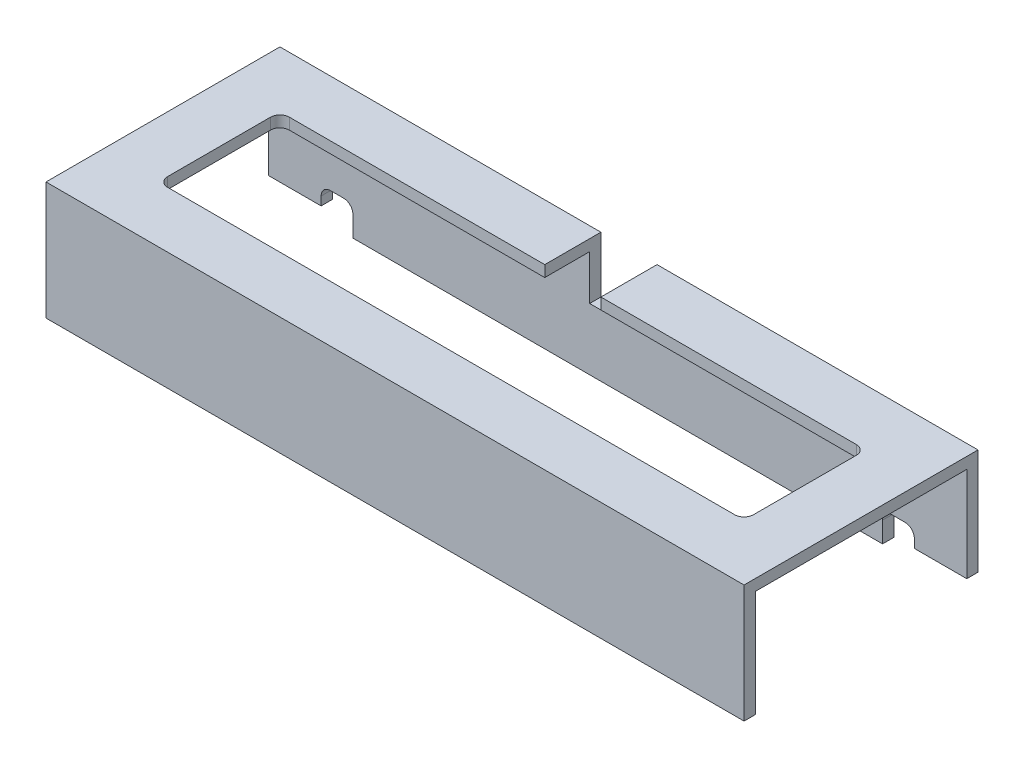
ISO-10303-21;
HEADER;
FILE_DESCRIPTION(('STEP AP214'),'2;1');
FILE_NAME('part.step','',(''),(''),'','','');
FILE_SCHEMA(('AUTOMOTIVE_DESIGN { 1 0 10303 214 1 1 1 1 }'));
ENDSEC;
DATA;
#1=APPLICATION_CONTEXT('core data for automotive mechanical design processes');
#2=APPLICATION_PROTOCOL_DEFINITION('international standard','automotive_design',2000,#1);
#3=PRODUCT_CONTEXT('',#1,'mechanical');
#4=PRODUCT('Part','Part','',(#3));
#5=PRODUCT_RELATED_PRODUCT_CATEGORY('part','',(#4));
#6=PRODUCT_DEFINITION_FORMATION('','',#4);
#7=PRODUCT_DEFINITION_CONTEXT('part definition',#1,'design');
#8=PRODUCT_DEFINITION('design','',#6,#7);
#9=PRODUCT_DEFINITION_SHAPE('','',#8);
#10=(LENGTH_UNIT() NAMED_UNIT(*) SI_UNIT(.MILLI.,.METRE.));
#11=(NAMED_UNIT(*) PLANE_ANGLE_UNIT() SI_UNIT($,.RADIAN.));
#12=(NAMED_UNIT(*) SI_UNIT($,.STERADIAN.) SOLID_ANGLE_UNIT());
#13=UNCERTAINTY_MEASURE_WITH_UNIT(LENGTH_MEASURE(1.E-05),#10,'distance_accuracy_value','');
#14=(GEOMETRIC_REPRESENTATION_CONTEXT(3) GLOBAL_UNCERTAINTY_ASSIGNED_CONTEXT((#13)) GLOBAL_UNIT_ASSIGNED_CONTEXT((#10,
#11,#12)) REPRESENTATION_CONTEXT('',''));
#15=CARTESIAN_POINT('',(0.,0.,0.));
#16=DIRECTION('',(0.,0.,1.));
#17=DIRECTION('',(1.,0.,0.));
#18=AXIS2_PLACEMENT_3D('',#15,#16,#17);
#19=CARTESIAN_POINT('',(451.478569788377,63.,-125.));
#20=DIRECTION('',(0.,-1.,0.));
#21=DIRECTION('',(0.,0.,-1.));
#22=AXIS2_PLACEMENT_3D('',#19,#20,#21);
#23=PLANE('',#22);
#24=DIRECTION('',(1.,0.,0.));
#25=VECTOR('',#24,1.);
#26=CARTESIAN_POINT('',(0.,63.,-95.));
#27=LINE('',#26,#25);
#28=CARTESIAN_POINT('',(139.999999999998,63.,-95.));
#29=VERTEX_POINT('',#28);
#30=CARTESIAN_POINT('',(276.499999999998,63.,-95.));
#31=VERTEX_POINT('',#30);
#32=EDGE_CURVE('E268',#29,#31,#27,.T.);
#33=ORIENTED_EDGE('',*,*,#32,.T.);
#34=CARTESIAN_POINT('',(276.499999999998,63.,-90.));
#35=DIRECTION('',(0.,-1.,0.));
#36=DIRECTION('',(0.,0.,-1.));
#37=AXIS2_PLACEMENT_3D('',#34,#35,#36);
#38=CIRCLE('',#37,5.);
#39=CARTESIAN_POINT('',(281.499999999998,63.,-90.));
#40=VERTEX_POINT('',#39);
#41=EDGE_CURVE('E362',#31,#40,#38,.T.);
#42=ORIENTED_EDGE('',*,*,#41,.T.);
#43=DIRECTION('',(0.,0.,-1.));
#44=VECTOR('',#43,1.);
#45=CARTESIAN_POINT('',(281.499999999998,63.,0.));
#46=LINE('',#45,#44);
#47=CARTESIAN_POINT('',(281.499999999998,63.,-35.));
#48=VERTEX_POINT('',#47);
#49=EDGE_CURVE('E395',#48,#40,#46,.T.);
#50=ORIENTED_EDGE('',*,*,#49,.F.);
#51=CARTESIAN_POINT('',(276.499999999998,63.,-35.));
#52=DIRECTION('',(0.,-1.,0.));
#53=DIRECTION('',(0.,0.,-1.));
#54=AXIS2_PLACEMENT_3D('',#51,#52,#53);
#55=CIRCLE('',#54,5.);
#56=CARTESIAN_POINT('',(276.499999999998,63.,-30.));
#57=VERTEX_POINT('',#56);
#58=EDGE_CURVE('E358',#48,#57,#55,.T.);
#59=ORIENTED_EDGE('',*,*,#58,.T.);
#60=DIRECTION('',(1.,0.,0.));
#61=VECTOR('',#60,1.);
#62=CARTESIAN_POINT('',(0.,63.,-30.));
#63=LINE('',#62,#61);
#64=CARTESIAN_POINT('',(-26.5000000000014,63.,-30.));
#65=VERTEX_POINT('',#64);
#66=EDGE_CURVE('E389',#65,#57,#63,.T.);
#67=ORIENTED_EDGE('',*,*,#66,.F.);
#68=CARTESIAN_POINT('',(-26.5000000000014,63.,-35.));
#69=DIRECTION('',(0.,-1.,0.));
#70=DIRECTION('',(0.,0.,-1.));
#71=AXIS2_PLACEMENT_3D('',#68,#69,#70);
#72=CIRCLE('',#71,5.);
#73=CARTESIAN_POINT('',(-31.5000000000014,63.,-35.));
#74=VERTEX_POINT('',#73);
#75=EDGE_CURVE('E365',#65,#74,#72,.T.);
#76=ORIENTED_EDGE('',*,*,#75,.T.);
#77=DIRECTION('',(0.,0.,1.));
#78=VECTOR('',#77,1.);
#79=CARTESIAN_POINT('',(-31.5000000000014,63.,0.));
#80=LINE('',#79,#78);
#81=CARTESIAN_POINT('',(-31.5000000000014,63.,-90.));
#82=VERTEX_POINT('',#81);
#83=EDGE_CURVE('E388',#82,#74,#80,.T.);
#84=ORIENTED_EDGE('',*,*,#83,.F.);
#85=CARTESIAN_POINT('',(-26.5000000000014,63.,-90.));
#86=DIRECTION('',(0.,-1.,0.));
#87=DIRECTION('',(0.,0.,-1.));
#88=AXIS2_PLACEMENT_3D('',#85,#86,#87);
#89=CIRCLE('',#88,5.);
#90=CARTESIAN_POINT('',(-26.5000000000014,63.,-95.));
#91=VERTEX_POINT('',#90);
#92=EDGE_CURVE('E44',#82,#91,#89,.T.);
#93=ORIENTED_EDGE('',*,*,#92,.T.);
#94=CARTESIAN_POINT('',(109.999999999998,63.,-95.));
#95=VERTEX_POINT('',#94);
#96=EDGE_CURVE('E393',#91,#95,#27,.T.);
#97=ORIENTED_EDGE('',*,*,#96,.T.);
#98=DIRECTION('',(0.,0.,-1.));
#99=VECTOR('',#98,1.);
#100=CARTESIAN_POINT('',(109.999999999998,63.,-95.));
#101=LINE('',#100,#99);
#102=CARTESIAN_POINT('',(109.999999999998,63.,-125.));
#103=VERTEX_POINT('',#102);
#104=EDGE_CURVE('E277',#95,#103,#101,.T.);
#105=ORIENTED_EDGE('',*,*,#104,.T.);
#106=DIRECTION('',(-1.,0.,0.));
#107=VECTOR('',#106,1.);
#108=CARTESIAN_POINT('',(451.478569788377,63.,-125.));
#109=LINE('',#108,#107);
#110=CARTESIAN_POINT('',(-61.5000000000014,63.,-125.));
#111=VERTEX_POINT('',#110);
#112=EDGE_CURVE('E503',#103,#111,#109,.T.);
#113=ORIENTED_EDGE('',*,*,#112,.T.);
#114=DIRECTION('',(0.,0.,-1.));
#115=VECTOR('',#114,1.);
#116=CARTESIAN_POINT('',(-61.5000000000014,63.,-125.));
#117=LINE('',#116,#115);
#118=CARTESIAN_POINT('',(-61.5000000000014,63.,0.));
#119=VERTEX_POINT('',#118);
#120=EDGE_CURVE('E473',#119,#111,#117,.T.);
#121=ORIENTED_EDGE('',*,*,#120,.F.);
#122=DIRECTION('',(-1.,0.,0.));
#123=VECTOR('',#122,1.);
#124=CARTESIAN_POINT('',(451.478569788377,63.,0.));
#125=LINE('',#124,#123);
#126=CARTESIAN_POINT('',(311.499999999998,63.,0.));
#127=VERTEX_POINT('',#126);
#128=EDGE_CURVE('E482',#127,#119,#125,.T.);
#129=ORIENTED_EDGE('',*,*,#128,.F.);
#130=DIRECTION('',(0.,0.,-1.));
#131=VECTOR('',#130,1.);
#132=CARTESIAN_POINT('',(311.499999999998,63.,-125.));
#133=LINE('',#132,#131);
#134=CARTESIAN_POINT('',(311.499999999998,63.,-125.));
#135=VERTEX_POINT('',#134);
#136=EDGE_CURVE('E487',#127,#135,#133,.T.);
#137=ORIENTED_EDGE('',*,*,#136,.T.);
#138=CARTESIAN_POINT('',(139.999999999998,63.,-125.));
#139=VERTEX_POINT('',#138);
#140=EDGE_CURVE('E504',#135,#139,#109,.T.);
#141=ORIENTED_EDGE('',*,*,#140,.T.);
#142=DIRECTION('',(0.,0.,-1.));
#143=VECTOR('',#142,1.);
#144=CARTESIAN_POINT('',(139.999999999998,63.,-95.));
#145=LINE('',#144,#143);
#146=EDGE_CURVE('E419',#29,#139,#145,.T.);
#147=ORIENTED_EDGE('',*,*,#146,.F.);
#148=EDGE_LOOP('',(#33,#42,#50,#59,#67,#76,#84,#93,#97,#105,#113,#121,#129,#137,#141,#147));
#149=FACE_BOUND('',#148,.T.);
#150=ADVANCED_FACE('F36',(#149),#23,.F.);
#151=CARTESIAN_POINT('',(451.478569788377,57.,-6.));
#152=DIRECTION('',(0.,1.,0.));
#153=DIRECTION('',(0.,0.,1.));
#154=AXIS2_PLACEMENT_3D('',#151,#152,#153);
#155=PLANE('',#154);
#156=DIRECTION('',(-1.,0.,0.));
#157=VECTOR('',#156,1.);
#158=CARTESIAN_POINT('',(0.,57.,-95.));
#159=LINE('',#158,#157);
#160=CARTESIAN_POINT('',(109.999999999998,57.,-95.));
#161=VERTEX_POINT('',#160);
#162=CARTESIAN_POINT('',(-26.5000000000014,57.,-95.));
#163=VERTEX_POINT('',#162);
#164=EDGE_CURVE('E269',#161,#163,#159,.T.);
#165=ORIENTED_EDGE('',*,*,#164,.T.);
#166=CARTESIAN_POINT('',(-26.5000000000014,57.,-90.));
#167=DIRECTION('',(0.,1.,0.));
#168=DIRECTION('',(0.,0.,1.));
#169=AXIS2_PLACEMENT_3D('',#166,#167,#168);
#170=CIRCLE('',#169,5.);
#171=CARTESIAN_POINT('',(-31.5000000000014,57.,-90.));
#172=VERTEX_POINT('',#171);
#173=EDGE_CURVE('E11',#163,#172,#170,.T.);
#174=ORIENTED_EDGE('',*,*,#173,.T.);
#175=DIRECTION('',(0.,0.,-1.));
#176=VECTOR('',#175,1.);
#177=CARTESIAN_POINT('',(-31.5000000000014,57.,0.));
#178=LINE('',#177,#176);
#179=CARTESIAN_POINT('',(-31.5000000000014,57.,-35.));
#180=VERTEX_POINT('',#179);
#181=EDGE_CURVE('E375',#180,#172,#178,.T.);
#182=ORIENTED_EDGE('',*,*,#181,.F.);
#183=CARTESIAN_POINT('',(-26.5000000000014,57.,-35.));
#184=DIRECTION('',(0.,1.,0.));
#185=DIRECTION('',(0.,0.,1.));
#186=AXIS2_PLACEMENT_3D('',#183,#184,#185);
#187=CIRCLE('',#186,5.);
#188=CARTESIAN_POINT('',(-26.5000000000014,57.,-30.));
#189=VERTEX_POINT('',#188);
#190=EDGE_CURVE('E367',#180,#189,#187,.T.);
#191=ORIENTED_EDGE('',*,*,#190,.T.);
#192=DIRECTION('',(-1.,0.,0.));
#193=VECTOR('',#192,1.);
#194=CARTESIAN_POINT('',(0.,57.,-30.));
#195=LINE('',#194,#193);
#196=CARTESIAN_POINT('',(276.499999999998,57.,-30.));
#197=VERTEX_POINT('',#196);
#198=EDGE_CURVE('E372',#197,#189,#195,.T.);
#199=ORIENTED_EDGE('',*,*,#198,.F.);
#200=CARTESIAN_POINT('',(276.499999999998,57.,-35.));
#201=DIRECTION('',(0.,1.,0.));
#202=DIRECTION('',(0.,0.,1.));
#203=AXIS2_PLACEMENT_3D('',#200,#201,#202);
#204=CIRCLE('',#203,5.);
#205=CARTESIAN_POINT('',(281.499999999998,57.,-35.));
#206=VERTEX_POINT('',#205);
#207=EDGE_CURVE('E360',#197,#206,#204,.T.);
#208=ORIENTED_EDGE('',*,*,#207,.T.);
#209=DIRECTION('',(0.,0.,1.));
#210=VECTOR('',#209,1.);
#211=CARTESIAN_POINT('',(281.499999999998,57.,0.));
#212=LINE('',#211,#210);
#213=CARTESIAN_POINT('',(281.499999999998,57.,-90.));
#214=VERTEX_POINT('',#213);
#215=EDGE_CURVE('E384',#214,#206,#212,.T.);
#216=ORIENTED_EDGE('',*,*,#215,.F.);
#217=CARTESIAN_POINT('',(276.499999999998,57.,-90.));
#218=DIRECTION('',(0.,1.,0.));
#219=DIRECTION('',(0.,0.,1.));
#220=AXIS2_PLACEMENT_3D('',#217,#218,#219);
#221=CIRCLE('',#220,5.);
#222=CARTESIAN_POINT('',(276.499999999998,57.,-95.));
#223=VERTEX_POINT('',#222);
#224=EDGE_CURVE('E264',#214,#223,#221,.T.);
#225=ORIENTED_EDGE('',*,*,#224,.T.);
#226=CARTESIAN_POINT('',(139.999999999998,57.,-95.));
#227=VERTEX_POINT('',#226);
#228=EDGE_CURVE('E255',#223,#227,#159,.T.);
#229=ORIENTED_EDGE('',*,*,#228,.T.);
#230=DIRECTION('',(0.,0.,1.));
#231=VECTOR('',#230,1.);
#232=CARTESIAN_POINT('',(139.999999999998,57.,-6.));
#233=LINE('',#232,#231);
#234=CARTESIAN_POINT('',(139.999999999998,57.,-119.));
#235=VERTEX_POINT('',#234);
#236=EDGE_CURVE('E260',#235,#227,#233,.T.);
#237=ORIENTED_EDGE('',*,*,#236,.F.);
#238=DIRECTION('',(-1.,0.,0.));
#239=VECTOR('',#238,1.);
#240=CARTESIAN_POINT('',(451.478569788377,57.,-119.));
#241=LINE('',#240,#239);
#242=CARTESIAN_POINT('',(311.499999999998,57.,-119.));
#243=VERTEX_POINT('',#242);
#244=EDGE_CURVE('E514',#243,#235,#241,.T.);
#245=ORIENTED_EDGE('',*,*,#244,.F.);
#246=DIRECTION('',(0.,0.,1.));
#247=VECTOR('',#246,1.);
#248=CARTESIAN_POINT('',(311.499999999998,57.,-6.00000000000004));
#249=LINE('',#248,#247);
#250=CARTESIAN_POINT('',(311.499999999998,57.,-6.));
#251=VERTEX_POINT('',#250);
#252=EDGE_CURVE('E489',#243,#251,#249,.T.);
#253=ORIENTED_EDGE('',*,*,#252,.T.);
#254=DIRECTION('',(-1.,0.,0.));
#255=VECTOR('',#254,1.);
#256=CARTESIAN_POINT('',(451.478569788377,57.,-6.));
#257=LINE('',#256,#255);
#258=CARTESIAN_POINT('',(-61.5000000000014,57.,-6.));
#259=VERTEX_POINT('',#258);
#260=EDGE_CURVE('E516',#251,#259,#257,.T.);
#261=ORIENTED_EDGE('',*,*,#260,.T.);
#262=DIRECTION('',(0.,0.,1.));
#263=VECTOR('',#262,1.);
#264=CARTESIAN_POINT('',(-61.5000000000014,57.,-5.99999999999994));
#265=LINE('',#264,#263);
#266=CARTESIAN_POINT('',(-61.5000000000014,57.,-119.));
#267=VERTEX_POINT('',#266);
#268=EDGE_CURVE('E464',#267,#259,#265,.T.);
#269=ORIENTED_EDGE('',*,*,#268,.F.);
#270=CARTESIAN_POINT('',(109.999999999998,57.,-119.));
#271=VERTEX_POINT('',#270);
#272=EDGE_CURVE('E513',#271,#267,#241,.T.);
#273=ORIENTED_EDGE('',*,*,#272,.F.);
#274=DIRECTION('',(0.,0.,1.));
#275=VECTOR('',#274,1.);
#276=CARTESIAN_POINT('',(109.999999999998,57.,-6.));
#277=LINE('',#276,#275);
#278=EDGE_CURVE('E284',#271,#161,#277,.T.);
#279=ORIENTED_EDGE('',*,*,#278,.T.);
#280=EDGE_LOOP('',(#165,#174,#182,#191,#199,#208,#216,#225,#229,#237,#245,#253,#261,#269,#273,#279));
#281=FACE_BOUND('',#280,.T.);
#282=ADVANCED_FACE('F257',(#281),#155,.F.);
#283=CARTESIAN_POINT('',(451.478569788377,0.,-125.));
#284=DIRECTION('',(0.,0.,1.));
#285=DIRECTION('',(0.,-1.,0.));
#286=AXIS2_PLACEMENT_3D('',#283,#284,#285);
#287=PLANE('',#286);
#288=ORIENTED_EDGE('',*,*,#112,.F.);
#289=DIRECTION('',(0.,1.,0.));
#290=VECTOR('',#289,1.);
#291=CARTESIAN_POINT('',(109.999999999998,0.,-125.));
#292=LINE('',#291,#290);
#293=CARTESIAN_POINT('',(109.999999999998,33.,-125.));
#294=VERTEX_POINT('',#293);
#295=EDGE_CURVE('E406',#294,#103,#292,.T.);
#296=ORIENTED_EDGE('',*,*,#295,.F.);
#297=DIRECTION('',(1.,0.,0.));
#298=VECTOR('',#297,1.);
#299=CARTESIAN_POINT('',(0.,33.0000000000001,-125.));
#300=LINE('',#299,#298);
#301=CARTESIAN_POINT('',(139.999999999998,33.,-125.));
#302=VERTEX_POINT('',#301);
#303=EDGE_CURVE('E404',#294,#302,#300,.T.);
#304=ORIENTED_EDGE('',*,*,#303,.T.);
#305=DIRECTION('',(0.,1.,0.));
#306=VECTOR('',#305,1.);
#307=CARTESIAN_POINT('',(139.999999999998,0.,-125.));
#308=LINE('',#307,#306);
#309=EDGE_CURVE('E408',#302,#139,#308,.T.);
#310=ORIENTED_EDGE('',*,*,#309,.T.);
#311=ORIENTED_EDGE('',*,*,#140,.F.);
#312=DIRECTION('',(0.,-1.,0.));
#313=VECTOR('',#312,1.);
#314=CARTESIAN_POINT('',(311.499999999998,0.,-125.));
#315=LINE('',#314,#313);
#316=CARTESIAN_POINT('',(311.499999999998,6.3999999999958,-125.));
#317=VERTEX_POINT('',#316);
#318=EDGE_CURVE('E483',#135,#317,#315,.T.);
#319=ORIENTED_EDGE('',*,*,#318,.T.);
#320=DIRECTION('',(1.,0.,0.));
#321=VECTOR('',#320,1.);
#322=CARTESIAN_POINT('',(-4.55984456540696E-13,6.3999999999751,-125.));
#323=LINE('',#322,#321);
#324=CARTESIAN_POINT('',(283.499999999998,6.3999999999953,-125.));
#325=VERTEX_POINT('',#324);
#326=EDGE_CURVE('E446',#325,#317,#323,.T.);
#327=ORIENTED_EDGE('',*,*,#326,.F.);
#328=DIRECTION('',(0.,1.,0.));
#329=VECTOR('',#328,1.);
#330=CARTESIAN_POINT('',(283.499999999998,0.,-125.));
#331=LINE('',#330,#329);
#332=CARTESIAN_POINT('',(283.499999999998,11.0000000000001,-125.));
#333=VERTEX_POINT('',#332);
#334=EDGE_CURVE('E443',#325,#333,#331,.T.);
#335=ORIENTED_EDGE('',*,*,#334,.T.);
#336=CARTESIAN_POINT('',(278.499999999998,11.0000000000001,-125.));
#337=DIRECTION('',(0.,0.,1.));
#338=DIRECTION('',(0.,-1.,0.));
#339=AXIS2_PLACEMENT_3D('',#336,#337,#338);
#340=CIRCLE('',#339,5.);
#341=CARTESIAN_POINT('',(278.499999999998,16.0000000000001,-125.));
#342=VERTEX_POINT('',#341);
#343=EDGE_CURVE('E354',#333,#342,#340,.T.);
#344=ORIENTED_EDGE('',*,*,#343,.T.);
#345=DIRECTION('',(1.,0.,0.));
#346=VECTOR('',#345,1.);
#347=CARTESIAN_POINT('',(0.,16.0000000000002,-125.));
#348=LINE('',#347,#346);
#349=CARTESIAN_POINT('',(271.499999999998,16.0000000000001,-125.));
#350=VERTEX_POINT('',#349);
#351=EDGE_CURVE('E451',#350,#342,#348,.T.);
#352=ORIENTED_EDGE('',*,*,#351,.F.);
#353=CARTESIAN_POINT('',(271.499999999998,11.0000000000001,-125.));
#354=DIRECTION('',(0.,0.,1.));
#355=DIRECTION('',(0.,-1.,0.));
#356=AXIS2_PLACEMENT_3D('',#353,#354,#355);
#357=CIRCLE('',#356,5.);
#358=CARTESIAN_POINT('',(266.499999999998,11.0000000000001,-125.));
#359=VERTEX_POINT('',#358);
#360=EDGE_CURVE('E350',#350,#359,#357,.T.);
#361=ORIENTED_EDGE('',*,*,#360,.T.);
#362=DIRECTION('',(0.,1.,0.));
#363=VECTOR('',#362,1.);
#364=CARTESIAN_POINT('',(266.499999999998,0.,-125.));
#365=LINE('',#364,#363);
#366=CARTESIAN_POINT('',(266.499999999998,0.,-125.));
#367=VERTEX_POINT('',#366);
#368=EDGE_CURVE('E448',#367,#359,#365,.T.);
#369=ORIENTED_EDGE('',*,*,#368,.F.);
#370=DIRECTION('',(-1.,0.,0.));
#371=VECTOR('',#370,1.);
#372=CARTESIAN_POINT('',(451.478569788377,0.,-125.));
#373=LINE('',#372,#371);
#374=CARTESIAN_POINT('',(-16.5000000000013,0.,-125.));
#375=VERTEX_POINT('',#374);
#376=EDGE_CURVE('E507',#367,#375,#373,.T.);
#377=ORIENTED_EDGE('',*,*,#376,.T.);
#378=DIRECTION('',(0.,1.,0.));
#379=VECTOR('',#378,1.);
#380=CARTESIAN_POINT('',(-16.5000000000013,0.,-125.));
#381=LINE('',#380,#379);
#382=CARTESIAN_POINT('',(-16.5000000000013,11.0000000000001,-125.));
#383=VERTEX_POINT('',#382);
#384=EDGE_CURVE('E431',#375,#383,#381,.T.);
#385=ORIENTED_EDGE('',*,*,#384,.T.);
#386=CARTESIAN_POINT('',(-21.5000000000013,11.0000000000001,-125.));
#387=DIRECTION('',(0.,0.,1.));
#388=DIRECTION('',(0.,-1.,0.));
#389=AXIS2_PLACEMENT_3D('',#386,#387,#388);
#390=CIRCLE('',#389,5.);
#391=CARTESIAN_POINT('',(-21.5000000000013,16.0000000000001,-125.));
#392=VERTEX_POINT('',#391);
#393=EDGE_CURVE('E346',#383,#392,#390,.T.);
#394=ORIENTED_EDGE('',*,*,#393,.T.);
#395=DIRECTION('',(-1.,0.,0.));
#396=VECTOR('',#395,1.);
#397=CARTESIAN_POINT('',(0.,16.0000000000001,-125.));
#398=LINE('',#397,#396);
#399=CARTESIAN_POINT('',(-28.5000000000013,16.0000000000001,-125.));
#400=VERTEX_POINT('',#399);
#401=EDGE_CURVE('E428',#392,#400,#398,.T.);
#402=ORIENTED_EDGE('',*,*,#401,.T.);
#403=CARTESIAN_POINT('',(-28.5000000000013,11.0000000000001,-125.));
#404=DIRECTION('',(0.,0.,1.));
#405=DIRECTION('',(0.,-1.,0.));
#406=AXIS2_PLACEMENT_3D('',#403,#404,#405);
#407=CIRCLE('',#406,5.);
#408=CARTESIAN_POINT('',(-33.5000000000013,11.0000000000001,-125.));
#409=VERTEX_POINT('',#408);
#410=EDGE_CURVE('E342',#400,#409,#407,.T.);
#411=ORIENTED_EDGE('',*,*,#410,.T.);
#412=DIRECTION('',(0.,1.,0.));
#413=VECTOR('',#412,1.);
#414=CARTESIAN_POINT('',(-33.5000000000013,0.,-125.));
#415=LINE('',#414,#413);
#416=CARTESIAN_POINT('',(-33.5000000000013,6.3999999999953,-125.));
#417=VERTEX_POINT('',#416);
#418=EDGE_CURVE('E425',#417,#409,#415,.T.);
#419=ORIENTED_EDGE('',*,*,#418,.F.);
#420=DIRECTION('',(-1.,0.,0.));
#421=VECTOR('',#420,1.);
#422=CARTESIAN_POINT('',(4.18316175349381E-13,6.39999999999311,-125.));
#423=LINE('',#422,#421);
#424=CARTESIAN_POINT('',(-61.5000000000014,6.39999999999621,-125.));
#425=VERTEX_POINT('',#424);
#426=EDGE_CURVE('E402',#417,#425,#423,.T.);
#427=ORIENTED_EDGE('',*,*,#426,.T.);
#428=DIRECTION('',(0.,-1.,0.));
#429=VECTOR('',#428,1.);
#430=CARTESIAN_POINT('',(-61.5000000000014,0.,-125.));
#431=LINE('',#430,#429);
#432=EDGE_CURVE('E470',#111,#425,#431,.T.);
#433=ORIENTED_EDGE('',*,*,#432,.F.);
#434=EDGE_LOOP('',(#288,#296,#304,#310,#311,#319,#327,#335,#344,#352,#361,#369,#377,#385,#394,
#402,#411,#419,#427,#433));
#435=FACE_BOUND('',#434,.T.);
#436=ADVANCED_FACE('F551',(#435),#287,.F.);
#437=CARTESIAN_POINT('',(451.478569788377,0.,-119.));
#438=DIRECTION('',(0.,1.,0.));
#439=DIRECTION('',(0.,0.,1.));
#440=AXIS2_PLACEMENT_3D('',#437,#438,#439);
#441=PLANE('',#440);
#442=DIRECTION('',(0.,0.,-1.));
#443=VECTOR('',#442,1.);
#444=CARTESIAN_POINT('',(-16.5000000000013,0.,-95.));
#445=LINE('',#444,#443);
#446=CARTESIAN_POINT('',(-16.5000000000013,0.,-119.));
#447=VERTEX_POINT('',#446);
#448=EDGE_CURVE('E409',#447,#375,#445,.T.);
#449=ORIENTED_EDGE('',*,*,#448,.T.);
#450=ORIENTED_EDGE('',*,*,#376,.F.);
#451=DIRECTION('',(0.,0.,-1.));
#452=VECTOR('',#451,1.);
#453=CARTESIAN_POINT('',(266.499999999998,0.,-95.));
#454=LINE('',#453,#452);
#455=CARTESIAN_POINT('',(266.499999999998,0.,-119.));
#456=VERTEX_POINT('',#455);
#457=EDGE_CURVE('E455',#456,#367,#454,.T.);
#458=ORIENTED_EDGE('',*,*,#457,.F.);
#459=DIRECTION('',(-1.,0.,0.));
#460=VECTOR('',#459,1.);
#461=CARTESIAN_POINT('',(451.478569788377,0.,-119.));
#462=LINE('',#461,#460);
#463=EDGE_CURVE('E510',#456,#447,#462,.T.);
#464=ORIENTED_EDGE('',*,*,#463,.T.);
#465=EDGE_LOOP('',(#449,#450,#458,#464));
#466=FACE_BOUND('',#465,.T.);
#467=ADVANCED_FACE('F617',(#466),#441,.F.);
#468=CARTESIAN_POINT('',(451.478569788377,57.,-119.));
#469=DIRECTION('',(0.,0.,-1.));
#470=DIRECTION('',(-1.,0.,0.));
#471=AXIS2_PLACEMENT_3D('',#468,#469,#470);
#472=PLANE('',#471);
#473=DIRECTION('',(1.,0.,0.));
#474=VECTOR('',#473,1.);
#475=CARTESIAN_POINT('',(451.478569788377,33.,-119.));
#476=LINE('',#475,#474);
#477=CARTESIAN_POINT('',(109.999999999998,33.,-119.));
#478=VERTEX_POINT('',#477);
#479=CARTESIAN_POINT('',(139.999999999998,33.,-119.));
#480=VERTEX_POINT('',#479);
#481=EDGE_CURVE('E302',#478,#480,#476,.T.);
#482=ORIENTED_EDGE('',*,*,#481,.F.);
#483=DIRECTION('',(0.,1.,0.));
#484=VECTOR('',#483,1.);
#485=CARTESIAN_POINT('',(109.999999999998,57.,-119.));
#486=LINE('',#485,#484);
#487=EDGE_CURVE('E440',#478,#271,#486,.T.);
#488=ORIENTED_EDGE('',*,*,#487,.T.);
#489=ORIENTED_EDGE('',*,*,#272,.T.);
#490=DIRECTION('',(0.,1.,0.));
#491=VECTOR('',#490,1.);
#492=CARTESIAN_POINT('',(-61.5000000000014,57.,-119.));
#493=LINE('',#492,#491);
#494=CARTESIAN_POINT('',(-61.5000000000014,6.39999999999712,-119.));
#495=VERTEX_POINT('',#494);
#496=EDGE_CURVE('E467',#495,#267,#493,.T.);
#497=ORIENTED_EDGE('',*,*,#496,.F.);
#498=DIRECTION('',(-1.,0.,0.));
#499=VECTOR('',#498,1.);
#500=CARTESIAN_POINT('',(451.478569788373,6.39999999996359,-119.));
#501=LINE('',#500,#499);
#502=CARTESIAN_POINT('',(-33.5000000000013,6.39999999999529,-119.));
#503=VERTEX_POINT('',#502);
#504=EDGE_CURVE('E416',#503,#495,#501,.T.);
#505=ORIENTED_EDGE('',*,*,#504,.F.);
#506=DIRECTION('',(0.,1.,0.));
#507=VECTOR('',#506,1.);
#508=CARTESIAN_POINT('',(-33.5000000000013,57.,-119.));
#509=LINE('',#508,#507);
#510=CARTESIAN_POINT('',(-33.5000000000013,11.0000000000001,-119.));
#511=VERTEX_POINT('',#510);
#512=EDGE_CURVE('E288',#503,#511,#509,.T.);
#513=ORIENTED_EDGE('',*,*,#512,.T.);
#514=CARTESIAN_POINT('',(-28.5000000000013,11.0000000000001,-119.));
#515=DIRECTION('',(0.,0.,-1.));
#516=DIRECTION('',(-1.,0.,0.));
#517=AXIS2_PLACEMENT_3D('',#514,#515,#516);
#518=CIRCLE('',#517,5.);
#519=CARTESIAN_POINT('',(-28.5000000000013,16.0000000000001,-119.));
#520=VERTEX_POINT('',#519);
#521=EDGE_CURVE('E344',#511,#520,#518,.T.);
#522=ORIENTED_EDGE('',*,*,#521,.T.);
#523=DIRECTION('',(-1.,0.,0.));
#524=VECTOR('',#523,1.);
#525=CARTESIAN_POINT('',(451.478569788377,16.0000000000002,-119.));
#526=LINE('',#525,#524);
#527=CARTESIAN_POINT('',(-21.5000000000014,16.0000000000001,-119.));
#528=VERTEX_POINT('',#527);
#529=EDGE_CURVE('E296',#528,#520,#526,.T.);
#530=ORIENTED_EDGE('',*,*,#529,.F.);
#531=CARTESIAN_POINT('',(-21.5000000000013,11.0000000000001,-119.));
#532=DIRECTION('',(0.,0.,-1.));
#533=DIRECTION('',(-1.,0.,0.));
#534=AXIS2_PLACEMENT_3D('',#531,#532,#533);
#535=CIRCLE('',#534,5.);
#536=CARTESIAN_POINT('',(-16.5000000000013,11.0000000000001,-119.));
#537=VERTEX_POINT('',#536);
#538=EDGE_CURVE('E348',#528,#537,#535,.T.);
#539=ORIENTED_EDGE('',*,*,#538,.T.);
#540=DIRECTION('',(0.,1.,0.));
#541=VECTOR('',#540,1.);
#542=CARTESIAN_POINT('',(-16.5000000000013,57.,-119.));
#543=LINE('',#542,#541);
#544=EDGE_CURVE('E299',#447,#537,#543,.T.);
#545=ORIENTED_EDGE('',*,*,#544,.F.);
#546=ORIENTED_EDGE('',*,*,#463,.F.);
#547=DIRECTION('',(0.,1.,0.));
#548=VECTOR('',#547,1.);
#549=CARTESIAN_POINT('',(266.499999999998,57.,-119.));
#550=LINE('',#549,#548);
#551=CARTESIAN_POINT('',(266.499999999998,11.0000000000001,-119.));
#552=VERTEX_POINT('',#551);
#553=EDGE_CURVE('E290',#456,#552,#550,.T.);
#554=ORIENTED_EDGE('',*,*,#553,.T.);
#555=CARTESIAN_POINT('',(271.499999999998,11.0000000000001,-119.));
#556=DIRECTION('',(0.,0.,-1.));
#557=DIRECTION('',(-1.,0.,0.));
#558=AXIS2_PLACEMENT_3D('',#555,#556,#557);
#559=CIRCLE('',#558,5.);
#560=CARTESIAN_POINT('',(271.499999999998,16.0000000000001,-119.));
#561=VERTEX_POINT('',#560);
#562=EDGE_CURVE('E352',#552,#561,#559,.T.);
#563=ORIENTED_EDGE('',*,*,#562,.T.);
#564=DIRECTION('',(1.,0.,0.));
#565=VECTOR('',#564,1.);
#566=CARTESIAN_POINT('',(451.478569788377,16.0000000000001,-119.));
#567=LINE('',#566,#565);
#568=CARTESIAN_POINT('',(278.499999999998,16.0000000000001,-119.));
#569=VERTEX_POINT('',#568);
#570=EDGE_CURVE('E529',#561,#569,#567,.T.);
#571=ORIENTED_EDGE('',*,*,#570,.T.);
#572=CARTESIAN_POINT('',(278.499999999998,11.0000000000001,-119.));
#573=DIRECTION('',(0.,0.,-1.));
#574=DIRECTION('',(-1.,0.,0.));
#575=AXIS2_PLACEMENT_3D('',#572,#573,#574);
#576=CIRCLE('',#575,5.);
#577=CARTESIAN_POINT('',(283.499999999998,11.0000000000001,-119.));
#578=VERTEX_POINT('',#577);
#579=EDGE_CURVE('E356',#569,#578,#576,.T.);
#580=ORIENTED_EDGE('',*,*,#579,.T.);
#581=DIRECTION('',(0.,1.,0.));
#582=VECTOR('',#581,1.);
#583=CARTESIAN_POINT('',(283.499999999998,57.,-119.));
#584=LINE('',#583,#582);
#585=CARTESIAN_POINT('',(283.499999999998,6.39999999999529,-119.));
#586=VERTEX_POINT('',#585);
#587=EDGE_CURVE('E526',#586,#578,#584,.T.);
#588=ORIENTED_EDGE('',*,*,#587,.F.);
#589=DIRECTION('',(1.,0.,0.));
#590=VECTOR('',#589,1.);
#591=CARTESIAN_POINT('',(451.47856978838,6.40000000000727,-119.));
#592=LINE('',#591,#590);
#593=CARTESIAN_POINT('',(311.499999999998,6.39999999999629,-119.));
#594=VERTEX_POINT('',#593);
#595=EDGE_CURVE('E457',#586,#594,#592,.T.);
#596=ORIENTED_EDGE('',*,*,#595,.T.);
#597=DIRECTION('',(0.,1.,0.));
#598=VECTOR('',#597,1.);
#599=CARTESIAN_POINT('',(311.499999999998,57.,-119.));
#600=LINE('',#599,#598);
#601=EDGE_CURVE('E486',#594,#243,#600,.T.);
#602=ORIENTED_EDGE('',*,*,#601,.T.);
#603=ORIENTED_EDGE('',*,*,#244,.T.);
#604=DIRECTION('',(0.,1.,0.));
#605=VECTOR('',#604,1.);
#606=CARTESIAN_POINT('',(139.999999999998,57.,-119.));
#607=LINE('',#606,#605);
#608=EDGE_CURVE('E283',#480,#235,#607,.T.);
#609=ORIENTED_EDGE('',*,*,#608,.F.);
#610=EDGE_LOOP('',(#482,#488,#489,#497,#505,#513,#522,#530,#539,#545,#546,#554,#563,#571,#580,
#588,#596,#602,#603,#609));
#611=FACE_BOUND('',#610,.T.);
#612=ADVANCED_FACE('F536',(#611),#472,.F.);
#613=CARTESIAN_POINT('',(-61.5000000000014,6.3999999999974,-124.999999999999));
#614=DIRECTION('',(1.,0.,0.));
#615=DIRECTION('',(0.,0.,-1.));
#616=AXIS2_PLACEMENT_3D('',#613,#614,#615);
#617=PLANE('',#616);
#618=DIRECTION('',(0.,0.,-1.));
#619=VECTOR('',#618,1.);
#620=CARTESIAN_POINT('',(-61.5000000000014,6.39999999999713,-124.999999999999));
#621=LINE('',#620,#619);
#622=EDGE_CURVE('E285',#495,#425,#621,.T.);
#623=ORIENTED_EDGE('',*,*,#622,.F.);
#624=ORIENTED_EDGE('',*,*,#496,.T.);
#625=ORIENTED_EDGE('',*,*,#268,.T.);
#626=DIRECTION('',(0.,-1.,0.));
#627=VECTOR('',#626,1.);
#628=CARTESIAN_POINT('',(-61.5000000000014,0.,-6.));
#629=LINE('',#628,#627);
#630=CARTESIAN_POINT('',(-61.5000000000014,0.,-6.));
#631=VERTEX_POINT('',#630);
#632=EDGE_CURVE('E461',#259,#631,#629,.T.);
#633=ORIENTED_EDGE('',*,*,#632,.T.);
#634=DIRECTION('',(0.,0.,1.));
#635=VECTOR('',#634,1.);
#636=CARTESIAN_POINT('',(-61.5000000000014,0.,0.));
#637=LINE('',#636,#635);
#638=CARTESIAN_POINT('',(-61.5000000000014,0.,0.));
#639=VERTEX_POINT('',#638);
#640=EDGE_CURVE('E479',#631,#639,#637,.T.);
#641=ORIENTED_EDGE('',*,*,#640,.T.);
#642=DIRECTION('',(0.,1.,0.));
#643=VECTOR('',#642,1.);
#644=CARTESIAN_POINT('',(-61.5000000000014,63.,0.));
#645=LINE('',#644,#643);
#646=EDGE_CURVE('E476',#639,#119,#645,.T.);
#647=ORIENTED_EDGE('',*,*,#646,.T.);
#648=ORIENTED_EDGE('',*,*,#120,.T.);
#649=ORIENTED_EDGE('',*,*,#432,.T.);
#650=EDGE_LOOP('',(#623,#624,#625,#633,#641,#647,#648,#649));
#651=FACE_BOUND('',#650,.T.);
#652=ADVANCED_FACE('F590',(#651),#617,.F.);
#653=CARTESIAN_POINT('',(451.478569788377,0.,-6.));
#654=DIRECTION('',(0.,0.,1.));
#655=DIRECTION('',(1.,0.,0.));
#656=AXIS2_PLACEMENT_3D('',#653,#654,#655);
#657=PLANE('',#656);
#658=ORIENTED_EDGE('',*,*,#260,.F.);
#659=DIRECTION('',(0.,-1.,0.));
#660=VECTOR('',#659,1.);
#661=CARTESIAN_POINT('',(311.499999999998,0.,-6.));
#662=LINE('',#661,#660);
#663=CARTESIAN_POINT('',(311.499999999998,0.,-6.));
#664=VERTEX_POINT('',#663);
#665=EDGE_CURVE('E492',#251,#664,#662,.T.);
#666=ORIENTED_EDGE('',*,*,#665,.T.);
#667=DIRECTION('',(-1.,0.,0.));
#668=VECTOR('',#667,1.);
#669=CARTESIAN_POINT('',(451.478569788377,0.,-6.));
#670=LINE('',#669,#668);
#671=EDGE_CURVE('E518',#664,#631,#670,.T.);
#672=ORIENTED_EDGE('',*,*,#671,.T.);
#673=ORIENTED_EDGE('',*,*,#632,.F.);
#674=EDGE_LOOP('',(#658,#666,#672,#673));
#675=FACE_BOUND('',#674,.T.);
#676=ADVANCED_FACE('F643',(#675),#657,.F.);
#677=CARTESIAN_POINT('',(451.478569788377,0.,0.));
#678=DIRECTION('',(0.,1.,0.));
#679=DIRECTION('',(0.,0.,1.));
#680=AXIS2_PLACEMENT_3D('',#677,#678,#679);
#681=PLANE('',#680);
#682=ORIENTED_EDGE('',*,*,#671,.F.);
#683=DIRECTION('',(0.,0.,1.));
#684=VECTOR('',#683,1.);
#685=CARTESIAN_POINT('',(311.499999999998,0.,0.));
#686=LINE('',#685,#684);
#687=CARTESIAN_POINT('',(311.499999999998,0.,0.));
#688=VERTEX_POINT('',#687);
#689=EDGE_CURVE('E495',#664,#688,#686,.T.);
#690=ORIENTED_EDGE('',*,*,#689,.T.);
#691=DIRECTION('',(-1.,0.,0.));
#692=VECTOR('',#691,1.);
#693=CARTESIAN_POINT('',(451.478569788377,0.,0.));
#694=LINE('',#693,#692);
#695=EDGE_CURVE('E520',#688,#639,#694,.T.);
#696=ORIENTED_EDGE('',*,*,#695,.T.);
#697=ORIENTED_EDGE('',*,*,#640,.F.);
#698=EDGE_LOOP('',(#682,#690,#696,#697));
#699=FACE_BOUND('',#698,.T.);
#700=ADVANCED_FACE('F646',(#699),#681,.F.);
#701=CARTESIAN_POINT('',(451.478569788377,63.,0.));
#702=DIRECTION('',(0.,0.,-1.));
#703=DIRECTION('',(0.,1.,0.));
#704=AXIS2_PLACEMENT_3D('',#701,#702,#703);
#705=PLANE('',#704);
#706=ORIENTED_EDGE('',*,*,#695,.F.);
#707=DIRECTION('',(0.,1.,0.));
#708=VECTOR('',#707,1.);
#709=CARTESIAN_POINT('',(311.499999999998,63.,0.));
#710=LINE('',#709,#708);
#711=EDGE_CURVE('E498',#688,#127,#710,.T.);
#712=ORIENTED_EDGE('',*,*,#711,.T.);
#713=ORIENTED_EDGE('',*,*,#128,.T.);
#714=ORIENTED_EDGE('',*,*,#646,.F.);
#715=EDGE_LOOP('',(#706,#712,#713,#714));
#716=FACE_BOUND('',#715,.T.);
#717=ADVANCED_FACE('F650',(#716),#705,.F.);
#718=CARTESIAN_POINT('',(311.499999999998,-7.60000000000271,-124.999999999999));
#719=DIRECTION('',(-1.,0.,0.));
#720=DIRECTION('',(0.,0.,-1.));
#721=AXIS2_PLACEMENT_3D('',#718,#719,#720);
#722=PLANE('',#721);
#723=ORIENTED_EDGE('',*,*,#601,.F.);
#724=DIRECTION('',(0.,0.,-1.));
#725=VECTOR('',#724,1.);
#726=CARTESIAN_POINT('',(311.499999999998,6.39999999999729,-124.999999999999));
#727=LINE('',#726,#725);
#728=EDGE_CURVE('E501',#594,#317,#727,.T.);
#729=ORIENTED_EDGE('',*,*,#728,.T.);
#730=ORIENTED_EDGE('',*,*,#318,.F.);
#731=ORIENTED_EDGE('',*,*,#136,.F.);
#732=ORIENTED_EDGE('',*,*,#711,.F.);
#733=ORIENTED_EDGE('',*,*,#689,.F.);
#734=ORIENTED_EDGE('',*,*,#665,.F.);
#735=ORIENTED_EDGE('',*,*,#252,.F.);
#736=EDGE_LOOP('',(#723,#729,#730,#731,#732,#733,#734,#735));
#737=FACE_BOUND('',#736,.T.);
#738=ADVANCED_FACE('F567',(#737),#722,.F.);
#739=CARTESIAN_POINT('',(283.499999999998,0.,-95.));
#740=DIRECTION('',(-1.,0.,0.));
#741=DIRECTION('',(0.,0.,1.));
#742=AXIS2_PLACEMENT_3D('',#739,#740,#741);
#743=PLANE('',#742);
#744=ORIENTED_EDGE('',*,*,#587,.T.);
#745=DIRECTION('',(0.,0.,-1.));
#746=VECTOR('',#745,1.);
#747=CARTESIAN_POINT('',(283.499999999998,11.0000000000001,-95.));
#748=LINE('',#747,#746);
#749=EDGE_CURVE('E321',#578,#333,#748,.T.);
#750=ORIENTED_EDGE('',*,*,#749,.T.);
#751=ORIENTED_EDGE('',*,*,#334,.F.);
#752=DIRECTION('',(0.,0.,-1.));
#753=VECTOR('',#752,1.);
#754=CARTESIAN_POINT('',(283.499999999998,6.39999999999528,-95.));
#755=LINE('',#754,#753);
#756=EDGE_CURVE('E454',#586,#325,#755,.T.);
#757=ORIENTED_EDGE('',*,*,#756,.F.);
#758=EDGE_LOOP('',(#744,#750,#751,#757));
#759=FACE_BOUND('',#758,.T.);
#760=ADVANCED_FACE('F560',(#759),#743,.T.);
#761=CARTESIAN_POINT('',(0.,16.0000000000002,-95.));
#762=DIRECTION('',(0.,1.,0.));
#763=DIRECTION('',(0.,0.,1.));
#764=AXIS2_PLACEMENT_3D('',#761,#762,#763);
#765=PLANE('',#764);
#766=ORIENTED_EDGE('',*,*,#570,.F.);
#767=DIRECTION('',(0.,0.,-1.));
#768=VECTOR('',#767,1.);
#769=CARTESIAN_POINT('',(271.499999999998,16.0000000000001,-125.));
#770=LINE('',#769,#768);
#771=EDGE_CURVE('E316',#561,#350,#770,.T.);
#772=ORIENTED_EDGE('',*,*,#771,.T.);
#773=ORIENTED_EDGE('',*,*,#351,.T.);
#774=DIRECTION('',(0.,0.,-1.));
#775=VECTOR('',#774,1.);
#776=CARTESIAN_POINT('',(278.499999999998,16.0000000000001,-95.));
#777=LINE('',#776,#775);
#778=EDGE_CURVE('E314',#342,#569,#777,.F.);
#779=ORIENTED_EDGE('',*,*,#778,.T.);
#780=EDGE_LOOP('',(#766,#772,#773,#779));
#781=FACE_BOUND('',#780,.T.);
#782=ADVANCED_FACE('F547',(#781),#765,.F.);
#783=CARTESIAN_POINT('',(266.499999999998,0.,-95.));
#784=DIRECTION('',(-1.,0.,0.));
#785=DIRECTION('',(0.,0.,1.));
#786=AXIS2_PLACEMENT_3D('',#783,#784,#785);
#787=PLANE('',#786);
#788=ORIENTED_EDGE('',*,*,#368,.T.);
#789=DIRECTION('',(0.,0.,-1.));
#790=VECTOR('',#789,1.);
#791=CARTESIAN_POINT('',(266.499999999998,11.0000000000001,-119.));
#792=LINE('',#791,#790);
#793=EDGE_CURVE('E319',#359,#552,#792,.F.);
#794=ORIENTED_EDGE('',*,*,#793,.T.);
#795=ORIENTED_EDGE('',*,*,#553,.F.);
#796=ORIENTED_EDGE('',*,*,#457,.T.);
#797=EDGE_LOOP('',(#788,#794,#795,#796));
#798=FACE_BOUND('',#797,.T.);
#799=ADVANCED_FACE('F618',(#798),#787,.F.);
#800=CARTESIAN_POINT('',(-4.55984456540696E-13,6.39999999997509,-95.));
#801=DIRECTION('',(0.,1.,0.));
#802=DIRECTION('',(-1.,0.,0.));
#803=AXIS2_PLACEMENT_3D('',#800,#801,#802);
#804=PLANE('',#803);
#805=ORIENTED_EDGE('',*,*,#756,.T.);
#806=ORIENTED_EDGE('',*,*,#326,.T.);
#807=ORIENTED_EDGE('',*,*,#728,.F.);
#808=ORIENTED_EDGE('',*,*,#595,.F.);
#809=EDGE_LOOP('',(#805,#806,#807,#808));
#810=FACE_BOUND('',#809,.T.);
#811=ADVANCED_FACE('F620',(#810),#804,.F.);
#812=CARTESIAN_POINT('',(-16.5000000000013,0.,-95.));
#813=DIRECTION('',(-1.,0.,0.));
#814=DIRECTION('',(0.,0.,1.));
#815=AXIS2_PLACEMENT_3D('',#812,#813,#814);
#816=PLANE('',#815);
#817=ORIENTED_EDGE('',*,*,#544,.T.);
#818=DIRECTION('',(0.,0.,-1.));
#819=VECTOR('',#818,1.);
#820=CARTESIAN_POINT('',(-16.5000000000013,11.0000000000001,-125.));
#821=LINE('',#820,#819);
#822=EDGE_CURVE('E311',#537,#383,#821,.T.);
#823=ORIENTED_EDGE('',*,*,#822,.T.);
#824=ORIENTED_EDGE('',*,*,#384,.F.);
#825=ORIENTED_EDGE('',*,*,#448,.F.);
#826=EDGE_LOOP('',(#817,#823,#824,#825));
#827=FACE_BOUND('',#826,.T.);
#828=ADVANCED_FACE('F614',(#827),#816,.T.);
#829=CARTESIAN_POINT('',(0.,16.0000000000001,-95.));
#830=DIRECTION('',(0.,-1.,0.));
#831=DIRECTION('',(0.,0.,-1.));
#832=AXIS2_PLACEMENT_3D('',#829,#830,#831);
#833=PLANE('',#832);
#834=ORIENTED_EDGE('',*,*,#529,.T.);
#835=DIRECTION('',(0.,0.,-1.));
#836=VECTOR('',#835,1.);
#837=CARTESIAN_POINT('',(-28.5000000000013,16.0000000000001,-95.));
#838=LINE('',#837,#836);
#839=EDGE_CURVE('E306',#520,#400,#838,.T.);
#840=ORIENTED_EDGE('',*,*,#839,.T.);
#841=ORIENTED_EDGE('',*,*,#401,.F.);
#842=DIRECTION('',(0.,0.,-1.));
#843=VECTOR('',#842,1.);
#844=CARTESIAN_POINT('',(-21.5000000000013,16.0000000000001,-119.));
#845=LINE('',#844,#843);
#846=EDGE_CURVE('E304',#392,#528,#845,.F.);
#847=ORIENTED_EDGE('',*,*,#846,.T.);
#848=EDGE_LOOP('',(#834,#840,#841,#847));
#849=FACE_BOUND('',#848,.T.);
#850=ADVANCED_FACE('F607',(#849),#833,.T.);
#851=CARTESIAN_POINT('',(-33.5000000000013,0.,-95.));
#852=DIRECTION('',(-1.,0.,0.));
#853=DIRECTION('',(0.,0.,1.));
#854=AXIS2_PLACEMENT_3D('',#851,#852,#853);
#855=PLANE('',#854);
#856=ORIENTED_EDGE('',*,*,#418,.T.);
#857=DIRECTION('',(0.,0.,-1.));
#858=VECTOR('',#857,1.);
#859=CARTESIAN_POINT('',(-33.5000000000013,11.0000000000001,-95.));
#860=LINE('',#859,#858);
#861=EDGE_CURVE('E309',#409,#511,#860,.F.);
#862=ORIENTED_EDGE('',*,*,#861,.T.);
#863=ORIENTED_EDGE('',*,*,#512,.F.);
#864=DIRECTION('',(0.,0.,-1.));
#865=VECTOR('',#864,1.);
#866=CARTESIAN_POINT('',(-33.5000000000013,6.39999999999528,-95.));
#867=LINE('',#866,#865);
#868=EDGE_CURVE('E434',#503,#417,#867,.T.);
#869=ORIENTED_EDGE('',*,*,#868,.T.);
#870=EDGE_LOOP('',(#856,#862,#863,#869));
#871=FACE_BOUND('',#870,.T.);
#872=ADVANCED_FACE('F599',(#871),#855,.F.);
#873=CARTESIAN_POINT('',(4.18316175349381E-13,6.39999999999309,-95.));
#874=DIRECTION('',(0.,-1.,0.));
#875=DIRECTION('',(1.,0.,0.));
#876=AXIS2_PLACEMENT_3D('',#873,#874,#875);
#877=PLANE('',#876);
#878=ORIENTED_EDGE('',*,*,#504,.T.);
#879=ORIENTED_EDGE('',*,*,#622,.T.);
#880=ORIENTED_EDGE('',*,*,#426,.F.);
#881=ORIENTED_EDGE('',*,*,#868,.F.);
#882=EDGE_LOOP('',(#878,#879,#880,#881));
#883=FACE_BOUND('',#882,.T.);
#884=ADVANCED_FACE('F594',(#883),#877,.T.);
#885=CARTESIAN_POINT('',(0.,33.0000000000001,-95.));
#886=DIRECTION('',(0.,1.,0.));
#887=DIRECTION('',(0.,0.,1.));
#888=AXIS2_PLACEMENT_3D('',#885,#886,#887);
#889=PLANE('',#888);
#890=ORIENTED_EDGE('',*,*,#481,.T.);
#891=DIRECTION('',(0.,0.,-1.));
#892=VECTOR('',#891,1.);
#893=CARTESIAN_POINT('',(139.999999999998,33.,-95.));
#894=LINE('',#893,#892);
#895=EDGE_CURVE('E417',#480,#302,#894,.T.);
#896=ORIENTED_EDGE('',*,*,#895,.T.);
#897=ORIENTED_EDGE('',*,*,#303,.F.);
#898=DIRECTION('',(0.,0.,-1.));
#899=VECTOR('',#898,1.);
#900=CARTESIAN_POINT('',(109.999999999998,33.,-95.));
#901=LINE('',#900,#899);
#902=EDGE_CURVE('E414',#478,#294,#901,.T.);
#903=ORIENTED_EDGE('',*,*,#902,.F.);
#904=EDGE_LOOP('',(#890,#896,#897,#903));
#905=FACE_BOUND('',#904,.T.);
#906=ADVANCED_FACE('F572',(#905),#889,.T.);
#907=CARTESIAN_POINT('',(109.999999999998,0.,-95.));
#908=DIRECTION('',(-1.,0.,0.));
#909=DIRECTION('',(0.,0.,1.));
#910=AXIS2_PLACEMENT_3D('',#907,#908,#909);
#911=PLANE('',#910);
#912=ORIENTED_EDGE('',*,*,#902,.T.);
#913=ORIENTED_EDGE('',*,*,#295,.T.);
#914=ORIENTED_EDGE('',*,*,#104,.F.);
#915=DIRECTION('',(0.,1.,0.));
#916=VECTOR('',#915,1.);
#917=CARTESIAN_POINT('',(109.999999999998,0.,-95.));
#918=LINE('',#917,#916);
#919=EDGE_CURVE('E278',#161,#95,#918,.T.);
#920=ORIENTED_EDGE('',*,*,#919,.F.);
#921=ORIENTED_EDGE('',*,*,#278,.F.);
#922=ORIENTED_EDGE('',*,*,#487,.F.);
#923=EDGE_LOOP('',(#912,#913,#914,#920,#921,#922));
#924=FACE_BOUND('',#923,.T.);
#925=ADVANCED_FACE('F580',(#924),#911,.F.);
#926=CARTESIAN_POINT('',(139.999999999998,0.,-95.));
#927=DIRECTION('',(-1.,0.,0.));
#928=DIRECTION('',(0.,0.,1.));
#929=AXIS2_PLACEMENT_3D('',#926,#927,#928);
#930=PLANE('',#929);
#931=ORIENTED_EDGE('',*,*,#608,.T.);
#932=ORIENTED_EDGE('',*,*,#236,.T.);
#933=DIRECTION('',(0.,1.,0.));
#934=VECTOR('',#933,1.);
#935=CARTESIAN_POINT('',(139.999999999998,0.,-95.));
#936=LINE('',#935,#934);
#937=EDGE_CURVE('E272',#227,#29,#936,.T.);
#938=ORIENTED_EDGE('',*,*,#937,.T.);
#939=ORIENTED_EDGE('',*,*,#146,.T.);
#940=ORIENTED_EDGE('',*,*,#309,.F.);
#941=ORIENTED_EDGE('',*,*,#895,.F.);
#942=EDGE_LOOP('',(#931,#932,#938,#939,#940,#941));
#943=FACE_BOUND('',#942,.T.);
#944=ADVANCED_FACE('F280',(#943),#930,.T.);
#945=CARTESIAN_POINT('',(0.,-0.001000000000001,-95.));
#946=DIRECTION('',(0.,0.,1.));
#947=DIRECTION('',(1.,0.,0.));
#948=AXIS2_PLACEMENT_3D('',#945,#946,#947);
#949=PLANE('',#948);
#950=ORIENTED_EDGE('',*,*,#96,.F.);
#951=DIRECTION('',(0.,1.,0.));
#952=VECTOR('',#951,1.);
#953=CARTESIAN_POINT('',(-26.5000000000014,-0.001000000000001,-95.));
#954=LINE('',#953,#952);
#955=EDGE_CURVE('E51',#91,#163,#954,.F.);
#956=ORIENTED_EDGE('',*,*,#955,.T.);
#957=ORIENTED_EDGE('',*,*,#164,.F.);
#958=ORIENTED_EDGE('',*,*,#919,.T.);
#959=EDGE_LOOP('',(#950,#956,#957,#958));
#960=FACE_BOUND('',#959,.T.);
#961=ADVANCED_FACE('F583',(#960),#949,.T.);
#962=CARTESIAN_POINT('',(281.499999999998,-0.001000000000001,0.));
#963=DIRECTION('',(1.,0.,0.));
#964=DIRECTION('',(0.,0.,-1.));
#965=AXIS2_PLACEMENT_3D('',#962,#963,#964);
#966=PLANE('',#965);
#967=ORIENTED_EDGE('',*,*,#215,.T.);
#968=DIRECTION('',(0.,1.,0.));
#969=VECTOR('',#968,1.);
#970=CARTESIAN_POINT('',(281.499999999998,63.,-35.));
#971=LINE('',#970,#969);
#972=EDGE_CURVE('E326',#206,#48,#971,.T.);
#973=ORIENTED_EDGE('',*,*,#972,.T.);
#974=ORIENTED_EDGE('',*,*,#49,.T.);
#975=DIRECTION('',(0.,1.,0.));
#976=VECTOR('',#975,1.);
#977=CARTESIAN_POINT('',(281.499999999998,-0.001000000000001,-90.));
#978=LINE('',#977,#976);
#979=EDGE_CURVE('E324',#40,#214,#978,.F.);
#980=ORIENTED_EDGE('',*,*,#979,.T.);
#981=EDGE_LOOP('',(#967,#973,#974,#980));
#982=FACE_BOUND('',#981,.T.);
#983=ADVANCED_FACE('F744',(#982),#966,.F.);
#984=CARTESIAN_POINT('',(0.,-0.001000000000001,-30.));
#985=DIRECTION('',(0.,0.,1.));
#986=DIRECTION('',(1.,0.,0.));
#987=AXIS2_PLACEMENT_3D('',#984,#985,#986);
#988=PLANE('',#987);
#989=ORIENTED_EDGE('',*,*,#66,.T.);
#990=DIRECTION('',(0.,1.,0.));
#991=VECTOR('',#990,1.);
#992=CARTESIAN_POINT('',(276.499999999998,57.,-30.));
#993=LINE('',#992,#991);
#994=EDGE_CURVE('E332',#57,#197,#993,.F.);
#995=ORIENTED_EDGE('',*,*,#994,.T.);
#996=ORIENTED_EDGE('',*,*,#198,.T.);
#997=DIRECTION('',(0.,1.,0.));
#998=VECTOR('',#997,1.);
#999=CARTESIAN_POINT('',(-26.5000000000014,63.,-30.));
#1000=LINE('',#999,#998);
#1001=EDGE_CURVE('E329',#189,#65,#1000,.T.);
#1002=ORIENTED_EDGE('',*,*,#1001,.T.);
#1003=EDGE_LOOP('',(#989,#995,#996,#1002));
#1004=FACE_BOUND('',#1003,.T.);
#1005=ADVANCED_FACE('F381',(#1004),#988,.F.);
#1006=CARTESIAN_POINT('',(-31.5000000000014,-0.001000000000001,0.));
#1007=DIRECTION('',(-1.,0.,0.));
#1008=DIRECTION('',(0.,0.,1.));
#1009=AXIS2_PLACEMENT_3D('',#1006,#1007,#1008);
#1010=PLANE('',#1009);
#1011=ORIENTED_EDGE('',*,*,#83,.T.);
#1012=DIRECTION('',(0.,1.,0.));
#1013=VECTOR('',#1012,1.);
#1014=CARTESIAN_POINT('',(-31.5000000000014,57.,-35.));
#1015=LINE('',#1014,#1013);
#1016=EDGE_CURVE('E339',#74,#180,#1015,.F.);
#1017=ORIENTED_EDGE('',*,*,#1016,.T.);
#1018=ORIENTED_EDGE('',*,*,#181,.T.);
#1019=DIRECTION('',(0.,1.,0.));
#1020=VECTOR('',#1019,1.);
#1021=CARTESIAN_POINT('',(-31.5000000000014,-0.001000000000001,-90.));
#1022=LINE('',#1021,#1020);
#1023=EDGE_CURVE('E336',#172,#82,#1022,.T.);
#1024=ORIENTED_EDGE('',*,*,#1023,.T.);
#1025=EDGE_LOOP('',(#1011,#1017,#1018,#1024));
#1026=FACE_BOUND('',#1025,.T.);
#1027=ADVANCED_FACE('F391',(#1026),#1010,.F.);
#1028=ORIENTED_EDGE('',*,*,#228,.F.);
#1029=DIRECTION('',(0.,1.,0.));
#1030=VECTOR('',#1029,1.);
#1031=CARTESIAN_POINT('',(276.499999999998,-0.001000000000001,-95.));
#1032=LINE('',#1031,#1030);
#1033=EDGE_CURVE('E334',#223,#31,#1032,.T.);
#1034=ORIENTED_EDGE('',*,*,#1033,.T.);
#1035=ORIENTED_EDGE('',*,*,#32,.F.);
#1036=ORIENTED_EDGE('',*,*,#937,.F.);
#1037=EDGE_LOOP('',(#1028,#1034,#1035,#1036));
#1038=FACE_BOUND('',#1037,.T.);
#1039=ADVANCED_FACE('F273',(#1038),#949,.T.);
#1040=CARTESIAN_POINT('',(-28.5000000000013,11.0000000000001,-95.));
#1041=DIRECTION('',(0.,0.,-1.));
#1042=DIRECTION('',(0.,1.,0.));
#1043=AXIS2_PLACEMENT_3D('',#1040,#1041,#1042);
#1044=CYLINDRICAL_SURFACE('',#1043,5.);
#1045=ORIENTED_EDGE('',*,*,#521,.F.);
#1046=ORIENTED_EDGE('',*,*,#861,.F.);
#1047=ORIENTED_EDGE('',*,*,#410,.F.);
#1048=ORIENTED_EDGE('',*,*,#839,.F.);
#1049=EDGE_LOOP('',(#1045,#1046,#1047,#1048));
#1050=FACE_BOUND('',#1049,.T.);
#1051=ADVANCED_FACE('F602',(#1050),#1044,.F.);
#1052=CARTESIAN_POINT('',(-21.5000000000013,11.0000000000001,-95.));
#1053=DIRECTION('',(0.,0.,1.));
#1054=DIRECTION('',(0.,-1.,0.));
#1055=AXIS2_PLACEMENT_3D('',#1052,#1053,#1054);
#1056=CYLINDRICAL_SURFACE('',#1055,5.);
#1057=ORIENTED_EDGE('',*,*,#538,.F.);
#1058=ORIENTED_EDGE('',*,*,#846,.F.);
#1059=ORIENTED_EDGE('',*,*,#393,.F.);
#1060=ORIENTED_EDGE('',*,*,#822,.F.);
#1061=EDGE_LOOP('',(#1057,#1058,#1059,#1060));
#1062=FACE_BOUND('',#1061,.T.);
#1063=ADVANCED_FACE('F611',(#1062),#1056,.F.);
#1064=CARTESIAN_POINT('',(271.499999999998,11.0000000000001,-95.));
#1065=DIRECTION('',(0.,0.,1.));
#1066=DIRECTION('',(0.,-1.,0.));
#1067=AXIS2_PLACEMENT_3D('',#1064,#1065,#1066);
#1068=CYLINDRICAL_SURFACE('',#1067,5.);
#1069=ORIENTED_EDGE('',*,*,#562,.F.);
#1070=ORIENTED_EDGE('',*,*,#793,.F.);
#1071=ORIENTED_EDGE('',*,*,#360,.F.);
#1072=ORIENTED_EDGE('',*,*,#771,.F.);
#1073=EDGE_LOOP('',(#1069,#1070,#1071,#1072));
#1074=FACE_BOUND('',#1073,.T.);
#1075=ADVANCED_FACE('F544',(#1074),#1068,.F.);
#1076=CARTESIAN_POINT('',(278.499999999998,11.0000000000001,-95.));
#1077=DIRECTION('',(0.,0.,-1.));
#1078=DIRECTION('',(0.,1.,0.));
#1079=AXIS2_PLACEMENT_3D('',#1076,#1077,#1078);
#1080=CYLINDRICAL_SURFACE('',#1079,5.);
#1081=ORIENTED_EDGE('',*,*,#579,.F.);
#1082=ORIENTED_EDGE('',*,*,#778,.F.);
#1083=ORIENTED_EDGE('',*,*,#343,.F.);
#1084=ORIENTED_EDGE('',*,*,#749,.F.);
#1085=EDGE_LOOP('',(#1081,#1082,#1083,#1084));
#1086=FACE_BOUND('',#1085,.T.);
#1087=ADVANCED_FACE('F558',(#1086),#1080,.F.);
#1088=CARTESIAN_POINT('',(276.499999999998,-0.001000000000001,-35.));
#1089=DIRECTION('',(0.,-1.,0.));
#1090=DIRECTION('',(0.,0.,-1.));
#1091=AXIS2_PLACEMENT_3D('',#1088,#1089,#1090);
#1092=CYLINDRICAL_SURFACE('',#1091,5.);
#1093=ORIENTED_EDGE('',*,*,#207,.F.);
#1094=ORIENTED_EDGE('',*,*,#994,.F.);
#1095=ORIENTED_EDGE('',*,*,#58,.F.);
#1096=ORIENTED_EDGE('',*,*,#972,.F.);
#1097=EDGE_LOOP('',(#1093,#1094,#1095,#1096));
#1098=FACE_BOUND('',#1097,.T.);
#1099=ADVANCED_FACE('F663',(#1098),#1092,.F.);
#1100=CARTESIAN_POINT('',(276.499999999998,-0.001000000000001,-90.));
#1101=DIRECTION('',(0.,1.,0.));
#1102=DIRECTION('',(0.,0.,1.));
#1103=AXIS2_PLACEMENT_3D('',#1100,#1101,#1102);
#1104=CYLINDRICAL_SURFACE('',#1103,5.);
#1105=ORIENTED_EDGE('',*,*,#224,.F.);
#1106=ORIENTED_EDGE('',*,*,#979,.F.);
#1107=ORIENTED_EDGE('',*,*,#41,.F.);
#1108=ORIENTED_EDGE('',*,*,#1033,.F.);
#1109=EDGE_LOOP('',(#1105,#1106,#1107,#1108));
#1110=FACE_BOUND('',#1109,.T.);
#1111=ADVANCED_FACE('F666',(#1110),#1104,.F.);
#1112=CARTESIAN_POINT('',(-26.5000000000014,-0.001000000000001,-35.));
#1113=DIRECTION('',(0.,-1.,0.));
#1114=DIRECTION('',(0.,0.,-1.));
#1115=AXIS2_PLACEMENT_3D('',#1112,#1113,#1114);
#1116=CYLINDRICAL_SURFACE('',#1115,5.);
#1117=ORIENTED_EDGE('',*,*,#190,.F.);
#1118=ORIENTED_EDGE('',*,*,#1016,.F.);
#1119=ORIENTED_EDGE('',*,*,#75,.F.);
#1120=ORIENTED_EDGE('',*,*,#1001,.F.);
#1121=EDGE_LOOP('',(#1117,#1118,#1119,#1120));
#1122=FACE_BOUND('',#1121,.T.);
#1123=ADVANCED_FACE('F386',(#1122),#1116,.F.);
#1124=CARTESIAN_POINT('',(-26.5000000000014,-0.001000000000001,-90.));
#1125=DIRECTION('',(0.,1.,0.));
#1126=DIRECTION('',(0.,0.,1.));
#1127=AXIS2_PLACEMENT_3D('',#1124,#1125,#1126);
#1128=CYLINDRICAL_SURFACE('',#1127,5.);
#1129=ORIENTED_EDGE('',*,*,#173,.F.);
#1130=ORIENTED_EDGE('',*,*,#955,.F.);
#1131=ORIENTED_EDGE('',*,*,#92,.F.);
#1132=ORIENTED_EDGE('',*,*,#1023,.F.);
#1133=EDGE_LOOP('',(#1129,#1130,#1131,#1132));
#1134=FACE_BOUND('',#1133,.T.);
#1135=ADVANCED_FACE('F38',(#1134),#1128,.F.);
#1136=CLOSED_SHELL('',(#150,#282,#436,#467,#612,#652,#676,#700,#717,#738,#760,#782,#799,#811,
#828,#850,#872,#884,#906,#925,#944,#961,#983,#1005,#1027,#1039,#1051,#1063,#1075,#1087,#1099,
#1111,#1123,#1135));
#1137=MANIFOLD_SOLID_BREP('B2',#1136);
#1138=ADVANCED_BREP_SHAPE_REPRESENTATION('',(#18,#1137),#14);
#1139=SHAPE_DEFINITION_REPRESENTATION(#9,#1138);
ENDSEC;
END-ISO-10303-21;
